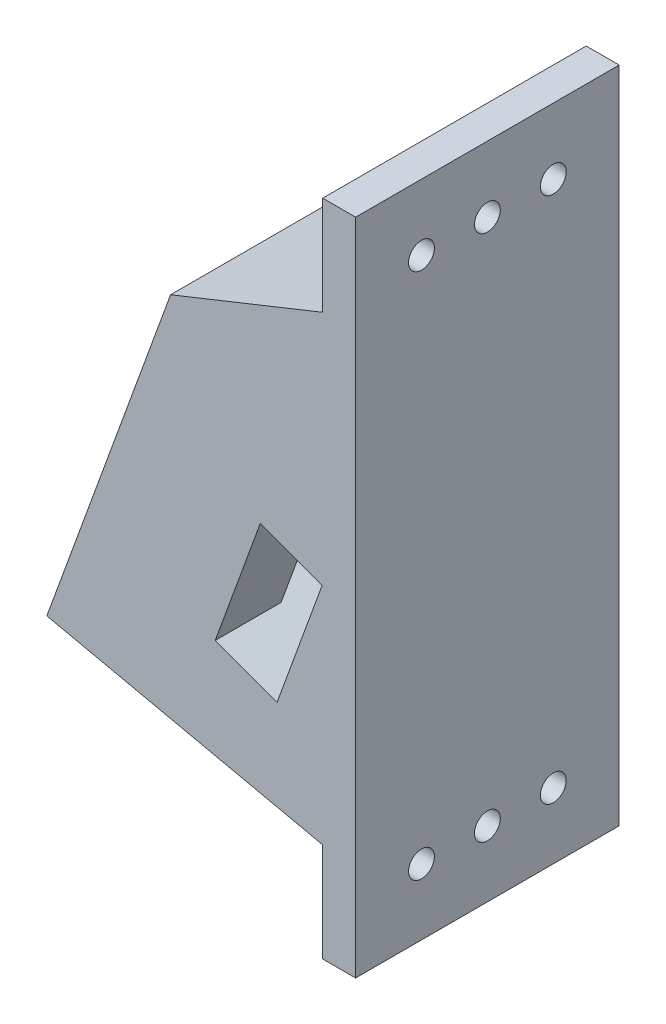
ISO-10303-21;
HEADER;
FILE_DESCRIPTION(('STEP AP214'),'2;1');
FILE_NAME('part.step','',(''),(''),'','','');
FILE_SCHEMA(('AUTOMOTIVE_DESIGN { 1 0 10303 214 1 1 1 1 }'));
ENDSEC;
DATA;
#1=APPLICATION_CONTEXT('core data for automotive mechanical design processes');
#2=APPLICATION_PROTOCOL_DEFINITION('international standard','automotive_design',2000,#1);
#3=PRODUCT_CONTEXT('',#1,'mechanical');
#4=PRODUCT('Part','Part','',(#3));
#5=PRODUCT_RELATED_PRODUCT_CATEGORY('part','',(#4));
#6=PRODUCT_DEFINITION_FORMATION('','',#4);
#7=PRODUCT_DEFINITION_CONTEXT('part definition',#1,'design');
#8=PRODUCT_DEFINITION('design','',#6,#7);
#9=PRODUCT_DEFINITION_SHAPE('','',#8);
#10=(LENGTH_UNIT() NAMED_UNIT(*) SI_UNIT(.MILLI.,.METRE.));
#11=(NAMED_UNIT(*) PLANE_ANGLE_UNIT() SI_UNIT($,.RADIAN.));
#12=(NAMED_UNIT(*) SI_UNIT($,.STERADIAN.) SOLID_ANGLE_UNIT());
#13=UNCERTAINTY_MEASURE_WITH_UNIT(LENGTH_MEASURE(1.E-05),#10,'distance_accuracy_value','');
#14=(GEOMETRIC_REPRESENTATION_CONTEXT(3) GLOBAL_UNCERTAINTY_ASSIGNED_CONTEXT((#13)) GLOBAL_UNIT_ASSIGNED_CONTEXT((#10,
#11,#12)) REPRESENTATION_CONTEXT('',''));
#15=CARTESIAN_POINT('',(0.,0.,0.));
#16=DIRECTION('',(0.,0.,1.));
#17=DIRECTION('',(1.,0.,0.));
#18=AXIS2_PLACEMENT_3D('',#15,#16,#17);
#19=CARTESIAN_POINT('',(-12.9038688104835,4.69662415389204,0.));
#20=DIRECTION('',(0.939692620785908,-0.34202014332567,0.));
#21=DIRECTION('',(0.34202014332567,0.939692620785908,0.));
#22=AXIS2_PLACEMENT_3D('',#19,#20,#21);
#23=PLANE('',#22);
#24=CARTESIAN_POINT('',(-34.6405452676712,-55.0244035862219,10.48));
#25=DIRECTION('',(0.939692620785908,-0.34202014332567,0.));
#26=DIRECTION('',(0.34202014332567,0.939692620785908,0.));
#27=AXIS2_PLACEMENT_3D('',#24,#25,#26);
#28=CIRCLE('',#27,2.54);
#29=CARTESIAN_POINT('',(-33.771814103624,-52.6375843294257,10.48));
#30=VERTEX_POINT('',#29);
#31=EDGE_CURVE('E11',#30,#30,#28,.F.);
#32=ORIENTED_EDGE('',*,*,#31,.F.);
#33=EDGE_LOOP('',(#32));
#34=FACE_BOUND('',#33,.T.);
#35=CARTESIAN_POINT('',(-34.6405452676712,-55.024403586222,40.32));
#36=DIRECTION('',(0.939692620785908,-0.34202014332567,0.));
#37=DIRECTION('',(0.34202014332567,0.939692620785908,0.));
#38=AXIS2_PLACEMENT_3D('',#35,#36,#37);
#39=CIRCLE('',#38,2.54);
#40=CARTESIAN_POINT('',(-33.771814103624,-52.6375843294258,40.32));
#41=VERTEX_POINT('',#40);
#42=EDGE_CURVE('E41',#41,#41,#39,.F.);
#43=ORIENTED_EDGE('',*,*,#42,.F.);
#44=EDGE_LOOP('',(#43));
#45=FACE_BOUND('',#44,.T.);
#46=CARTESIAN_POINT('',(-22.7245634742049,-22.2855126780409,40.32));
#47=DIRECTION('',(0.939692620785908,-0.34202014332567,0.));
#48=DIRECTION('',(0.34202014332567,0.939692620785908,0.));
#49=AXIS2_PLACEMENT_3D('',#46,#47,#48);
#50=CIRCLE('',#49,2.54);
#51=CARTESIAN_POINT('',(-21.8558323101577,-19.8986934212447,40.32));
#52=VERTEX_POINT('',#51);
#53=EDGE_CURVE('E344',#52,#52,#50,.F.);
#54=ORIENTED_EDGE('',*,*,#53,.F.);
#55=EDGE_LOOP('',(#54));
#56=FACE_BOUND('',#55,.T.);
#57=CARTESIAN_POINT('',(-22.7245634742049,-22.2855126780409,10.48));
#58=DIRECTION('',(0.939692620785908,-0.34202014332567,0.));
#59=DIRECTION('',(0.34202014332567,0.939692620785908,0.));
#60=AXIS2_PLACEMENT_3D('',#57,#58,#59);
#61=CIRCLE('',#60,2.54);
#62=CARTESIAN_POINT('',(-21.8558323101577,-19.8986934212447,10.48));
#63=VERTEX_POINT('',#62);
#64=EDGE_CURVE('E324',#63,#63,#61,.F.);
#65=ORIENTED_EDGE('',*,*,#64,.F.);
#66=EDGE_LOOP('',(#65));
#67=FACE_BOUND('',#66,.T.);
#68=DIRECTION('',(0.34202014332567,0.939692620785908,0.));
#69=VECTOR('',#68,1.);
#70=CARTESIAN_POINT('',(-36.3780075957656,-59.7980420998143,45.4));
#71=LINE('',#70,#69);
#72=CARTESIAN_POINT('',(-36.3780075957656,-59.7980420998143,45.4));
#73=VERTEX_POINT('',#72);
#74=CARTESIAN_POINT('',(-20.9871011461105,-17.5118741644485,45.4));
#75=VERTEX_POINT('',#74);
#76=EDGE_CURVE('E249',#73,#75,#71,.T.);
#77=ORIENTED_EDGE('',*,*,#76,.T.);
#78=DIRECTION('',(0.,0.,-1.));
#79=VECTOR('',#78,1.);
#80=CARTESIAN_POINT('',(-20.9871011461105,-17.5118741644485,5.40000000000001));
#81=LINE('',#80,#79);
#82=CARTESIAN_POINT('',(-20.9871011461105,-17.5118741644485,5.40000000000001));
#83=VERTEX_POINT('',#82);
#84=EDGE_CURVE('E252',#75,#83,#81,.T.);
#85=ORIENTED_EDGE('',*,*,#84,.T.);
#86=DIRECTION('',(-0.34202014332567,-0.939692620785908,0.));
#87=VECTOR('',#86,1.);
#88=CARTESIAN_POINT('',(-36.3780075957656,-59.7980420998143,5.40000000000001));
#89=LINE('',#88,#87);
#90=CARTESIAN_POINT('',(-36.3780075957656,-59.7980420998143,5.40000000000001));
#91=VERTEX_POINT('',#90);
#92=EDGE_CURVE('E256',#83,#91,#89,.T.);
#93=ORIENTED_EDGE('',*,*,#92,.T.);
#94=DIRECTION('',(0.,0.,1.));
#95=VECTOR('',#94,1.);
#96=CARTESIAN_POINT('',(-36.3780075957656,-59.7980420998143,5.40000000000001));
#97=LINE('',#96,#95);
#98=EDGE_CURVE('E259',#91,#73,#97,.T.);
#99=ORIENTED_EDGE('',*,*,#98,.T.);
#100=EDGE_LOOP('',(#77,#85,#93,#99));
#101=FACE_BOUND('',#100,.T.);
#102=DIRECTION('',(0.342020143325669,0.939692620785908,0.));
#103=VECTOR('',#102,1.);
#104=CARTESIAN_POINT('',(-33.0262101911741,-50.5890544161125,38.1));
#105=LINE('',#104,#103);
#106=CARTESIAN_POINT('',(-33.0262101911741,-50.5890544161125,38.1));
#107=VERTEX_POINT('',#106);
#108=CARTESIAN_POINT('',(-24.3388985507021,-26.7208618481504,38.1));
#109=VERTEX_POINT('',#108);
#110=EDGE_CURVE('E216',#107,#109,#105,.T.);
#111=ORIENTED_EDGE('',*,*,#110,.F.);
#112=DIRECTION('',(0.,0.,1.));
#113=VECTOR('',#112,1.);
#114=CARTESIAN_POINT('',(-33.0262101911741,-50.5890544161125,12.7));
#115=LINE('',#114,#113);
#116=CARTESIAN_POINT('',(-33.0262101911741,-50.5890544161125,12.7));
#117=VERTEX_POINT('',#116);
#118=EDGE_CURVE('E217',#117,#107,#115,.T.);
#119=ORIENTED_EDGE('',*,*,#118,.F.);
#120=DIRECTION('',(-0.342020143325669,-0.939692620785908,0.));
#121=VECTOR('',#120,1.);
#122=CARTESIAN_POINT('',(-33.0262101911741,-50.5890544161125,12.7));
#123=LINE('',#122,#121);
#124=CARTESIAN_POINT('',(-24.3388985507021,-26.7208618481504,12.7));
#125=VERTEX_POINT('',#124);
#126=EDGE_CURVE('E224',#125,#117,#123,.T.);
#127=ORIENTED_EDGE('',*,*,#126,.F.);
#128=DIRECTION('',(0.,0.,-1.));
#129=VECTOR('',#128,1.);
#130=CARTESIAN_POINT('',(-24.3388985507021,-26.7208618481504,12.7));
#131=LINE('',#130,#129);
#132=EDGE_CURVE('E221',#109,#125,#131,.T.);
#133=ORIENTED_EDGE('',*,*,#132,.F.);
#134=EDGE_LOOP('',(#111,#119,#127,#133));
#135=FACE_BOUND('',#134,.T.);
#136=ADVANCED_FACE('F33',(#34,#45,#56,#67,#101,#135),#23,.F.);
#137=CARTESIAN_POINT('',(0.,0.,50.8));
#138=DIRECTION('',(-1.,0.,0.));
#139=DIRECTION('',(0.,0.,1.));
#140=AXIS2_PLACEMENT_3D('',#137,#138,#139);
#141=PLANE('',#140);
#142=CARTESIAN_POINT('',(0.,18.7184148869281,12.7));
#143=DIRECTION('',(-1.,0.,0.));
#144=DIRECTION('',(0.,-1.,0.));
#145=AXIS2_PLACEMENT_3D('',#142,#143,#144);
#146=CIRCLE('',#145,2.4892);
#147=CARTESIAN_POINT('',(0.,16.2292148869281,12.7));
#148=VERTEX_POINT('',#147);
#149=EDGE_CURVE('E473',#148,#148,#146,.T.);
#150=ORIENTED_EDGE('',*,*,#149,.T.);
#151=EDGE_LOOP('',(#150));
#152=FACE_BOUND('',#151,.T.);
#153=CARTESIAN_POINT('',(0.,-82.8815851130719,12.7));
#154=DIRECTION('',(-1.,0.,0.));
#155=DIRECTION('',(0.,-1.,0.));
#156=AXIS2_PLACEMENT_3D('',#153,#154,#155);
#157=CIRCLE('',#156,2.48919999999999);
#158=CARTESIAN_POINT('',(0.,-85.3707851130719,12.7));
#159=VERTEX_POINT('',#158);
#160=EDGE_CURVE('E770',#159,#159,#157,.T.);
#161=ORIENTED_EDGE('',*,*,#160,.T.);
#162=EDGE_LOOP('',(#161));
#163=FACE_BOUND('',#162,.T.);
#164=CARTESIAN_POINT('',(0.,-82.8815851130719,38.1));
#165=DIRECTION('',(-1.,0.,0.));
#166=DIRECTION('',(0.,-1.,0.));
#167=AXIS2_PLACEMENT_3D('',#164,#165,#166);
#168=CIRCLE('',#167,2.48919999999999);
#169=CARTESIAN_POINT('',(0.,-85.3707851130719,38.1));
#170=VERTEX_POINT('',#169);
#171=EDGE_CURVE('E774',#170,#170,#168,.T.);
#172=ORIENTED_EDGE('',*,*,#171,.T.);
#173=EDGE_LOOP('',(#172));
#174=FACE_BOUND('',#173,.T.);
#175=CARTESIAN_POINT('',(0.,-82.8815851130719,25.4));
#176=DIRECTION('',(-1.,0.,0.));
#177=DIRECTION('',(0.,-1.,0.));
#178=AXIS2_PLACEMENT_3D('',#175,#176,#177);
#179=CIRCLE('',#178,2.4892);
#180=CARTESIAN_POINT('',(0.,-85.3707851130719,25.4));
#181=VERTEX_POINT('',#180);
#182=EDGE_CURVE('E458',#181,#181,#179,.T.);
#183=ORIENTED_EDGE('',*,*,#182,.T.);
#184=EDGE_LOOP('',(#183));
#185=FACE_BOUND('',#184,.T.);
#186=CARTESIAN_POINT('',(0.,18.7184148869281,38.1));
#187=DIRECTION('',(-1.,0.,0.));
#188=DIRECTION('',(0.,-1.,0.));
#189=AXIS2_PLACEMENT_3D('',#186,#187,#188);
#190=CIRCLE('',#189,2.4892);
#191=CARTESIAN_POINT('',(0.,16.2292148869281,38.1));
#192=VERTEX_POINT('',#191);
#193=EDGE_CURVE('E459',#192,#192,#190,.T.);
#194=ORIENTED_EDGE('',*,*,#193,.T.);
#195=EDGE_LOOP('',(#194));
#196=FACE_BOUND('',#195,.T.);
#197=CARTESIAN_POINT('',(0.,18.7184148869281,25.4));
#198=DIRECTION('',(-1.,0.,0.));
#199=DIRECTION('',(0.,-1.,0.));
#200=AXIS2_PLACEMENT_3D('',#197,#198,#199);
#201=CIRCLE('',#200,2.4892);
#202=CARTESIAN_POINT('',(0.,16.2292148869281,25.4));
#203=VERTEX_POINT('',#202);
#204=EDGE_CURVE('E468',#203,#203,#201,.T.);
#205=ORIENTED_EDGE('',*,*,#204,.T.);
#206=EDGE_LOOP('',(#205));
#207=FACE_BOUND('',#206,.T.);
#208=DIRECTION('',(0.,1.,0.));
#209=VECTOR('',#208,1.);
#210=CARTESIAN_POINT('',(0.,0.,0.));
#211=LINE('',#210,#209);
#212=CARTESIAN_POINT('',(0.,-95.5815851130719,0.));
#213=VERTEX_POINT('',#212);
#214=CARTESIAN_POINT('',(0.,31.4184148869281,0.));
#215=VERTEX_POINT('',#214);
#216=EDGE_CURVE('E285',#213,#215,#211,.T.);
#217=ORIENTED_EDGE('',*,*,#216,.T.);
#218=DIRECTION('',(0.,0.,-1.));
#219=VECTOR('',#218,1.);
#220=CARTESIAN_POINT('',(0.,31.4184148869281,50.8));
#221=LINE('',#220,#219);
#222=CARTESIAN_POINT('',(0.,31.4184148869281,50.8));
#223=VERTEX_POINT('',#222);
#224=EDGE_CURVE('E321',#223,#215,#221,.T.);
#225=ORIENTED_EDGE('',*,*,#224,.F.);
#226=DIRECTION('',(0.,-1.,0.));
#227=VECTOR('',#226,1.);
#228=CARTESIAN_POINT('',(0.,0.,50.8));
#229=LINE('',#228,#227);
#230=CARTESIAN_POINT('',(0.,-95.5815851130719,50.8));
#231=VERTEX_POINT('',#230);
#232=EDGE_CURVE('E281',#223,#231,#229,.T.);
#233=ORIENTED_EDGE('',*,*,#232,.T.);
#234=DIRECTION('',(0.,0.,-1.));
#235=VECTOR('',#234,1.);
#236=CARTESIAN_POINT('',(0.,-95.5815851130719,50.8));
#237=LINE('',#236,#235);
#238=EDGE_CURVE('E302',#231,#213,#237,.T.);
#239=ORIENTED_EDGE('',*,*,#238,.T.);
#240=EDGE_LOOP('',(#217,#225,#233,#239));
#241=FACE_BOUND('',#240,.T.);
#242=ADVANCED_FACE('F353',(#152,#163,#174,#185,#196,#207,#241),#141,.F.);
#243=CARTESIAN_POINT('',(0.,31.4184148869281,50.8));
#244=DIRECTION('',(0.,-1.,0.));
#245=DIRECTION('',(0.,0.,-1.));
#246=AXIS2_PLACEMENT_3D('',#243,#244,#245);
#247=PLANE('',#246);
#248=DIRECTION('',(-1.,0.,0.));
#249=VECTOR('',#248,1.);
#250=CARTESIAN_POINT('',(0.,31.4184148869281,0.));
#251=LINE('',#250,#249);
#252=CARTESIAN_POINT('',(-6.35,31.4184148869281,0.));
#253=VERTEX_POINT('',#252);
#254=EDGE_CURVE('E318',#215,#253,#251,.T.);
#255=ORIENTED_EDGE('',*,*,#254,.T.);
#256=DIRECTION('',(0.,0.,-1.));
#257=VECTOR('',#256,1.);
#258=CARTESIAN_POINT('',(-6.35,31.4184148869281,50.8));
#259=LINE('',#258,#257);
#260=CARTESIAN_POINT('',(-6.35,31.4184148869281,50.8));
#261=VERTEX_POINT('',#260);
#262=EDGE_CURVE('E325',#261,#253,#259,.T.);
#263=ORIENTED_EDGE('',*,*,#262,.F.);
#264=DIRECTION('',(-1.,0.,0.));
#265=VECTOR('',#264,1.);
#266=CARTESIAN_POINT('',(0.,31.4184148869281,50.8));
#267=LINE('',#266,#265);
#268=EDGE_CURVE('E300',#223,#261,#267,.T.);
#269=ORIENTED_EDGE('',*,*,#268,.F.);
#270=ORIENTED_EDGE('',*,*,#224,.T.);
#271=EDGE_LOOP('',(#255,#263,#269,#270));
#272=FACE_BOUND('',#271,.T.);
#273=ADVANCED_FACE('F392',(#272),#247,.F.);
#274=CARTESIAN_POINT('',(-6.35,31.4184148869281,50.8));
#275=DIRECTION('',(1.,0.,0.));
#276=DIRECTION('',(0.,0.,-1.));
#277=AXIS2_PLACEMENT_3D('',#274,#275,#276);
#278=PLANE('',#277);
#279=CARTESIAN_POINT('',(-6.35,18.7184148869281,12.7));
#280=DIRECTION('',(-1.,0.,0.));
#281=DIRECTION('',(0.,-1.,0.));
#282=AXIS2_PLACEMENT_3D('',#279,#280,#281);
#283=CIRCLE('',#282,2.4892);
#284=CARTESIAN_POINT('',(-6.35,16.2292148869281,12.7));
#285=VERTEX_POINT('',#284);
#286=EDGE_CURVE('E767',#285,#285,#283,.T.);
#287=ORIENTED_EDGE('',*,*,#286,.F.);
#288=EDGE_LOOP('',(#287));
#289=FACE_BOUND('',#288,.T.);
#290=CARTESIAN_POINT('',(-6.35,18.7184148869281,38.1));
#291=DIRECTION('',(-1.,0.,0.));
#292=DIRECTION('',(0.,-1.,0.));
#293=AXIS2_PLACEMENT_3D('',#290,#291,#292);
#294=CIRCLE('',#293,2.4892);
#295=CARTESIAN_POINT('',(-6.35,16.2292148869281,38.1));
#296=VERTEX_POINT('',#295);
#297=EDGE_CURVE('E464',#296,#296,#294,.T.);
#298=ORIENTED_EDGE('',*,*,#297,.F.);
#299=EDGE_LOOP('',(#298));
#300=FACE_BOUND('',#299,.T.);
#301=CARTESIAN_POINT('',(-6.35,18.7184148869281,25.4));
#302=DIRECTION('',(-1.,0.,0.));
#303=DIRECTION('',(0.,-1.,0.));
#304=AXIS2_PLACEMENT_3D('',#301,#302,#303);
#305=CIRCLE('',#304,2.4892);
#306=CARTESIAN_POINT('',(-6.35,16.2292148869281,25.4));
#307=VERTEX_POINT('',#306);
#308=EDGE_CURVE('E471',#307,#307,#305,.T.);
#309=ORIENTED_EDGE('',*,*,#308,.F.);
#310=EDGE_LOOP('',(#309));
#311=FACE_BOUND('',#310,.T.);
#312=DIRECTION('',(0.,-1.,0.));
#313=VECTOR('',#312,1.);
#314=CARTESIAN_POINT('',(-6.35,31.4184148869281,0.));
#315=LINE('',#314,#313);
#316=CARTESIAN_POINT('',(-6.35,12.3684148869281,0.));
#317=VERTEX_POINT('',#316);
#318=EDGE_CURVE('E316',#253,#317,#315,.T.);
#319=ORIENTED_EDGE('',*,*,#318,.T.);
#320=DIRECTION('',(0.,0.,-1.));
#321=VECTOR('',#320,1.);
#322=CARTESIAN_POINT('',(-6.35,12.3684148869281,50.8));
#323=LINE('',#322,#321);
#324=CARTESIAN_POINT('',(-6.35,12.3684148869281,50.8));
#325=VERTEX_POINT('',#324);
#326=EDGE_CURVE('E328',#325,#317,#323,.T.);
#327=ORIENTED_EDGE('',*,*,#326,.F.);
#328=DIRECTION('',(0.,-1.,0.));
#329=VECTOR('',#328,1.);
#330=CARTESIAN_POINT('',(-6.35,31.4184148869281,50.8));
#331=LINE('',#330,#329);
#332=EDGE_CURVE('E298',#261,#325,#331,.T.);
#333=ORIENTED_EDGE('',*,*,#332,.F.);
#334=ORIENTED_EDGE('',*,*,#262,.T.);
#335=EDGE_LOOP('',(#319,#327,#333,#334));
#336=FACE_BOUND('',#335,.T.);
#337=ADVANCED_FACE('F397',(#289,#300,#311,#336),#278,.F.);
#338=CARTESIAN_POINT('',(-6.35,12.3684148869281,50.8));
#339=DIRECTION('',(0.371416610588182,-0.928466316771474,0.));
#340=DIRECTION('',(0.928466316771474,0.371416610588182,0.));
#341=AXIS2_PLACEMENT_3D('',#338,#339,#340);
#342=PLANE('',#341);
#343=DIRECTION('',(-0.928466316771474,-0.371416610588182,0.));
#344=VECTOR('',#343,1.);
#345=CARTESIAN_POINT('',(-6.35,12.3684148869281,0.));
#346=LINE('',#345,#344);
#347=CARTESIAN_POINT('',(-35.6631056601617,0.6422228286434,0.));
#348=VERTEX_POINT('',#347);
#349=EDGE_CURVE('E314',#317,#348,#346,.T.);
#350=ORIENTED_EDGE('',*,*,#349,.T.);
#351=DIRECTION('',(0.,0.,-1.));
#352=VECTOR('',#351,1.);
#353=CARTESIAN_POINT('',(-35.6631056601617,0.6422228286434,50.8));
#354=LINE('',#353,#352);
#355=CARTESIAN_POINT('',(-35.6631056601617,0.6422228286434,50.8));
#356=VERTEX_POINT('',#355);
#357=EDGE_CURVE('E331',#356,#348,#354,.T.);
#358=ORIENTED_EDGE('',*,*,#357,.F.);
#359=DIRECTION('',(-0.928466316771474,-0.371416610588182,0.));
#360=VECTOR('',#359,1.);
#361=CARTESIAN_POINT('',(-6.35,12.3684148869281,50.8));
#362=LINE('',#361,#360);
#363=EDGE_CURVE('E296',#325,#356,#362,.T.);
#364=ORIENTED_EDGE('',*,*,#363,.F.);
#365=ORIENTED_EDGE('',*,*,#326,.T.);
#366=EDGE_LOOP('',(#350,#358,#364,#365));
#367=FACE_BOUND('',#366,.T.);
#368=ADVANCED_FACE('F404',(#367),#342,.F.);
#369=CARTESIAN_POINT('',(-35.6631056601617,0.6422228286434,50.8));
#370=DIRECTION('',(0.939692620785908,-0.34202014332567,0.));
#371=DIRECTION('',(0.34202014332567,0.939692620785908,0.));
#372=AXIS2_PLACEMENT_3D('',#369,#370,#371);
#373=PLANE('',#372);
#374=CARTESIAN_POINT('',(-37.6091256517106,-4.70442315594458,25.4));
#375=DIRECTION('',(-0.939692620785908,0.34202014332567,0.));
#376=DIRECTION('',(-0.34202014332567,-0.939692620785908,0.));
#377=AXIS2_PLACEMENT_3D('',#374,#375,#376);
#378=CIRCLE('',#377,2.4892);
#379=CARTESIAN_POINT('',(-38.4604821924769,-7.04350602760486,25.4));
#380=VERTEX_POINT('',#379);
#381=EDGE_CURVE('E241',#380,#380,#378,.T.);
#382=ORIENTED_EDGE('',*,*,#381,.F.);
#383=EDGE_LOOP('',(#382));
#384=FACE_BOUND('',#383,.T.);
#385=CARTESIAN_POINT('',(-57.3436879216018,-58.9246873752915,25.4));
#386=DIRECTION('',(-0.939692620785908,0.34202014332567,0.));
#387=DIRECTION('',(-0.34202014332567,-0.939692620785908,0.));
#388=AXIS2_PLACEMENT_3D('',#385,#386,#387);
#389=CIRCLE('',#388,2.4892);
#390=CARTESIAN_POINT('',(-58.195044462368,-61.2637702469518,25.4));
#391=VERTEX_POINT('',#390);
#392=EDGE_CURVE('E244',#391,#391,#389,.T.);
#393=ORIENTED_EDGE('',*,*,#392,.F.);
#394=EDGE_LOOP('',(#393));
#395=FACE_BOUND('',#394,.T.);
#396=DIRECTION('',(0.,0.,-1.));
#397=VECTOR('',#396,1.);
#398=CARTESIAN_POINT('',(-39.7809535618286,-10.6714712979351,5.40000000000001));
#399=LINE('',#398,#397);
#400=CARTESIAN_POINT('',(-39.7809535618286,-10.6714712979351,45.4));
#401=VERTEX_POINT('',#400);
#402=CARTESIAN_POINT('',(-39.7809535618286,-10.6714712979351,5.40000000000001));
#403=VERTEX_POINT('',#402);
#404=EDGE_CURVE('E264',#401,#403,#399,.T.);
#405=ORIENTED_EDGE('',*,*,#404,.F.);
#406=DIRECTION('',(0.34202014332567,0.939692620785908,0.));
#407=VECTOR('',#406,1.);
#408=CARTESIAN_POINT('',(-55.1718600114838,-52.957639233301,45.4));
#409=LINE('',#408,#407);
#410=CARTESIAN_POINT('',(-55.1718600114838,-52.957639233301,45.4));
#411=VERTEX_POINT('',#410);
#412=EDGE_CURVE('E240',#411,#401,#409,.T.);
#413=ORIENTED_EDGE('',*,*,#412,.F.);
#414=DIRECTION('',(0.,0.,1.));
#415=VECTOR('',#414,1.);
#416=CARTESIAN_POINT('',(-55.1718600114838,-52.957639233301,5.40000000000001));
#417=LINE('',#416,#415);
#418=CARTESIAN_POINT('',(-55.1718600114838,-52.957639233301,5.40000000000001));
#419=VERTEX_POINT('',#418);
#420=EDGE_CURVE('E253',#419,#411,#417,.T.);
#421=ORIENTED_EDGE('',*,*,#420,.F.);
#422=DIRECTION('',(-0.34202014332567,-0.939692620785908,0.));
#423=VECTOR('',#422,1.);
#424=CARTESIAN_POINT('',(-55.1718600114838,-52.957639233301,5.40000000000001));
#425=LINE('',#424,#423);
#426=EDGE_CURVE('E267',#403,#419,#425,.T.);
#427=ORIENTED_EDGE('',*,*,#426,.F.);
#428=EDGE_LOOP('',(#405,#413,#421,#427));
#429=FACE_BOUND('',#428,.T.);
#430=DIRECTION('',(-0.34202014332567,-0.939692620785908,0.));
#431=VECTOR('',#430,1.);
#432=CARTESIAN_POINT('',(-35.6631056601617,0.6422228286434,0.));
#433=LINE('',#432,#431);
#434=CARTESIAN_POINT('',(-59.5155158317198,-64.891735517282,0.));
#435=VERTEX_POINT('',#434);
#436=EDGE_CURVE('E311',#348,#435,#433,.T.);
#437=ORIENTED_EDGE('',*,*,#436,.T.);
#438=DIRECTION('',(0.,0.,-1.));
#439=VECTOR('',#438,1.);
#440=CARTESIAN_POINT('',(-59.5155158317198,-64.891735517282,50.8));
#441=LINE('',#440,#439);
#442=CARTESIAN_POINT('',(-59.5155158317198,-64.891735517282,50.8));
#443=VERTEX_POINT('',#442);
#444=EDGE_CURVE('E334',#443,#435,#441,.T.);
#445=ORIENTED_EDGE('',*,*,#444,.F.);
#446=DIRECTION('',(-0.34202014332567,-0.939692620785908,0.));
#447=VECTOR('',#446,1.);
#448=CARTESIAN_POINT('',(-35.6631056601617,0.6422228286434,50.8));
#449=LINE('',#448,#447);
#450=EDGE_CURVE('E294',#356,#443,#449,.T.);
#451=ORIENTED_EDGE('',*,*,#450,.F.);
#452=ORIENTED_EDGE('',*,*,#357,.T.);
#453=EDGE_LOOP('',(#437,#445,#451,#452));
#454=FACE_BOUND('',#453,.T.);
#455=ADVANCED_FACE('F408',(#384,#395,#429,#454),#373,.F.);
#456=CARTESIAN_POINT('',(-6.35,-76.5315851130719,50.8));
#457=DIRECTION('',(-0.213870348394887,-0.976862054784323,0.));
#458=DIRECTION('',(0.976862054784323,-0.213870348394887,0.));
#459=AXIS2_PLACEMENT_3D('',#456,#457,#458);
#460=PLANE('',#459);
#461=DIRECTION('',(-0.976862054784323,0.213870348394887,0.));
#462=VECTOR('',#461,1.);
#463=CARTESIAN_POINT('',(-6.35,-76.5315851130719,0.));
#464=LINE('',#463,#462);
#465=CARTESIAN_POINT('',(-6.35,-76.5315851130719,0.));
#466=VERTEX_POINT('',#465);
#467=EDGE_CURVE('E308',#466,#435,#464,.T.);
#468=ORIENTED_EDGE('',*,*,#467,.F.);
#469=DIRECTION('',(0.,0.,-1.));
#470=VECTOR('',#469,1.);
#471=CARTESIAN_POINT('',(-6.35,-76.5315851130719,50.8));
#472=LINE('',#471,#470);
#473=CARTESIAN_POINT('',(-6.35,-76.5315851130719,50.8));
#474=VERTEX_POINT('',#473);
#475=EDGE_CURVE('E336',#474,#466,#472,.T.);
#476=ORIENTED_EDGE('',*,*,#475,.F.);
#477=DIRECTION('',(-0.976862054784323,0.213870348394887,0.));
#478=VECTOR('',#477,1.);
#479=CARTESIAN_POINT('',(-6.35,-76.5315851130719,50.8));
#480=LINE('',#479,#478);
#481=EDGE_CURVE('E291',#474,#443,#480,.T.);
#482=ORIENTED_EDGE('',*,*,#481,.T.);
#483=ORIENTED_EDGE('',*,*,#444,.T.);
#484=EDGE_LOOP('',(#468,#476,#482,#483));
#485=FACE_BOUND('',#484,.T.);
#486=ADVANCED_FACE('F411',(#485),#460,.T.);
#487=CARTESIAN_POINT('',(-6.35,-95.5815851130719,50.8));
#488=DIRECTION('',(-1.,0.,0.));
#489=DIRECTION('',(0.,0.,1.));
#490=AXIS2_PLACEMENT_3D('',#487,#488,#489);
#491=PLANE('',#490);
#492=CARTESIAN_POINT('',(-6.34999999999999,-82.8815851130719,12.7));
#493=DIRECTION('',(-1.,0.,0.));
#494=DIRECTION('',(0.,-1.,0.));
#495=AXIS2_PLACEMENT_3D('',#492,#493,#494);
#496=CIRCLE('',#495,2.48919999999999);
#497=CARTESIAN_POINT('',(-6.34999999999999,-85.3707851130719,12.7));
#498=VERTEX_POINT('',#497);
#499=EDGE_CURVE('E449',#498,#498,#496,.T.);
#500=ORIENTED_EDGE('',*,*,#499,.F.);
#501=EDGE_LOOP('',(#500));
#502=FACE_BOUND('',#501,.T.);
#503=CARTESIAN_POINT('',(-6.34999999999999,-82.8815851130719,38.1));
#504=DIRECTION('',(-1.,0.,0.));
#505=DIRECTION('',(0.,-1.,0.));
#506=AXIS2_PLACEMENT_3D('',#503,#504,#505);
#507=CIRCLE('',#506,2.48919999999999);
#508=CARTESIAN_POINT('',(-6.34999999999999,-85.3707851130719,38.1));
#509=VERTEX_POINT('',#508);
#510=EDGE_CURVE('E453',#509,#509,#507,.T.);
#511=ORIENTED_EDGE('',*,*,#510,.F.);
#512=EDGE_LOOP('',(#511));
#513=FACE_BOUND('',#512,.T.);
#514=CARTESIAN_POINT('',(-6.34999999999999,-82.8815851130719,25.4));
#515=DIRECTION('',(-1.,0.,0.));
#516=DIRECTION('',(0.,-1.,0.));
#517=AXIS2_PLACEMENT_3D('',#514,#515,#516);
#518=CIRCLE('',#517,2.4892);
#519=CARTESIAN_POINT('',(-6.34999999999999,-85.3707851130719,25.4));
#520=VERTEX_POINT('',#519);
#521=EDGE_CURVE('E456',#520,#520,#518,.T.);
#522=ORIENTED_EDGE('',*,*,#521,.F.);
#523=EDGE_LOOP('',(#522));
#524=FACE_BOUND('',#523,.T.);
#525=DIRECTION('',(0.,1.,0.));
#526=VECTOR('',#525,1.);
#527=CARTESIAN_POINT('',(-6.35,-95.5815851130719,0.));
#528=LINE('',#527,#526);
#529=CARTESIAN_POINT('',(-6.35,-95.5815851130719,0.));
#530=VERTEX_POINT('',#529);
#531=EDGE_CURVE('E305',#530,#466,#528,.T.);
#532=ORIENTED_EDGE('',*,*,#531,.F.);
#533=DIRECTION('',(0.,0.,-1.));
#534=VECTOR('',#533,1.);
#535=CARTESIAN_POINT('',(-6.35,-95.5815851130719,50.8));
#536=LINE('',#535,#534);
#537=CARTESIAN_POINT('',(-6.35,-95.5815851130719,50.8));
#538=VERTEX_POINT('',#537);
#539=EDGE_CURVE('E338',#538,#530,#536,.T.);
#540=ORIENTED_EDGE('',*,*,#539,.F.);
#541=DIRECTION('',(0.,1.,0.));
#542=VECTOR('',#541,1.);
#543=CARTESIAN_POINT('',(-6.35,-95.5815851130719,50.8));
#544=LINE('',#543,#542);
#545=EDGE_CURVE('E288',#538,#474,#544,.T.);
#546=ORIENTED_EDGE('',*,*,#545,.T.);
#547=ORIENTED_EDGE('',*,*,#475,.T.);
#548=EDGE_LOOP('',(#532,#540,#546,#547));
#549=FACE_BOUND('',#548,.T.);
#550=ADVANCED_FACE('F414',(#502,#513,#524,#549),#491,.T.);
#551=CARTESIAN_POINT('',(0.,-95.5815851130719,50.8));
#552=DIRECTION('',(0.,-1.,0.));
#553=DIRECTION('',(0.,0.,-1.));
#554=AXIS2_PLACEMENT_3D('',#551,#552,#553);
#555=PLANE('',#554);
#556=DIRECTION('',(-1.,0.,0.));
#557=VECTOR('',#556,1.);
#558=CARTESIAN_POINT('',(0.,-95.5815851130719,0.));
#559=LINE('',#558,#557);
#560=EDGE_CURVE('E274',#213,#530,#559,.T.);
#561=ORIENTED_EDGE('',*,*,#560,.F.);
#562=ORIENTED_EDGE('',*,*,#238,.F.);
#563=DIRECTION('',(-1.,0.,0.));
#564=VECTOR('',#563,1.);
#565=CARTESIAN_POINT('',(0.,-95.5815851130719,50.8));
#566=LINE('',#565,#564);
#567=EDGE_CURVE('E284',#231,#538,#566,.T.);
#568=ORIENTED_EDGE('',*,*,#567,.T.);
#569=ORIENTED_EDGE('',*,*,#539,.T.);
#570=EDGE_LOOP('',(#561,#562,#568,#569));
#571=FACE_BOUND('',#570,.T.);
#572=ADVANCED_FACE('F35',(#571),#555,.T.);
#573=CARTESIAN_POINT('',(0.,0.,50.8));
#574=DIRECTION('',(0.,0.,-1.));
#575=DIRECTION('',(-1.,0.,0.));
#576=AXIS2_PLACEMENT_3D('',#573,#574,#575);
#577=PLANE('',#576);
#578=DIRECTION('',(0.342020143325669,0.939692620785908,0.));
#579=VECTOR('',#578,1.);
#580=CARTESIAN_POINT('',(-18.3718504087115,-28.8926897582684,50.8));
#581=LINE('',#580,#579);
#582=CARTESIAN_POINT('',(-27.0591620491835,-52.7608823262305,50.8));
#583=VERTEX_POINT('',#582);
#584=CARTESIAN_POINT('',(-18.3718504087115,-28.8926897582684,50.8));
#585=VERTEX_POINT('',#584);
#586=EDGE_CURVE('E200',#583,#585,#581,.T.);
#587=ORIENTED_EDGE('',*,*,#586,.T.);
#588=DIRECTION('',(0.939692620785908,-0.34202014332567,0.));
#589=VECTOR('',#588,1.);
#590=CARTESIAN_POINT('',(-6.43775412473051,-33.2363455785044,50.8));
#591=LINE('',#590,#589);
#592=CARTESIAN_POINT('',(-6.43775412473051,-33.2363455785044,50.8));
#593=VERTEX_POINT('',#592);
#594=EDGE_CURVE('E191',#585,#593,#591,.T.);
#595=ORIENTED_EDGE('',*,*,#594,.T.);
#596=DIRECTION('',(-0.342020143325669,-0.939692620785908,0.));
#597=VECTOR('',#596,1.);
#598=CARTESIAN_POINT('',(-6.43775412473051,-33.2363455785044,50.8));
#599=LINE('',#598,#597);
#600=CARTESIAN_POINT('',(-15.1250657652025,-57.1045381464665,50.8));
#601=VERTEX_POINT('',#600);
#602=EDGE_CURVE('E197',#593,#601,#599,.T.);
#603=ORIENTED_EDGE('',*,*,#602,.T.);
#604=DIRECTION('',(-0.939692620785908,0.34202014332567,0.));
#605=VECTOR('',#604,1.);
#606=CARTESIAN_POINT('',(-15.1250657652025,-57.1045381464665,50.8));
#607=LINE('',#606,#605);
#608=EDGE_CURVE('E175',#601,#583,#607,.T.);
#609=ORIENTED_EDGE('',*,*,#608,.T.);
#610=EDGE_LOOP('',(#587,#595,#603,#609));
#611=FACE_BOUND('',#610,.T.);
#612=ORIENTED_EDGE('',*,*,#232,.F.);
#613=ORIENTED_EDGE('',*,*,#268,.T.);
#614=ORIENTED_EDGE('',*,*,#332,.T.);
#615=ORIENTED_EDGE('',*,*,#363,.T.);
#616=ORIENTED_EDGE('',*,*,#450,.T.);
#617=ORIENTED_EDGE('',*,*,#481,.F.);
#618=ORIENTED_EDGE('',*,*,#545,.F.);
#619=ORIENTED_EDGE('',*,*,#567,.F.);
#620=EDGE_LOOP('',(#612,#613,#614,#615,#616,#617,#618,#619));
#621=FACE_BOUND('',#620,.T.);
#622=ADVANCED_FACE('F380',(#611,#621),#577,.F.);
#623=CARTESIAN_POINT('',(0.,0.,0.));
#624=DIRECTION('',(0.,0.,-1.));
#625=DIRECTION('',(-1.,0.,0.));
#626=AXIS2_PLACEMENT_3D('',#623,#624,#625);
#627=PLANE('',#626);
#628=DIRECTION('',(0.939692620785908,-0.34202014332567,0.));
#629=VECTOR('',#628,1.);
#630=CARTESIAN_POINT('',(-6.43775412473051,-33.2363455785044,0.));
#631=LINE('',#630,#629);
#632=CARTESIAN_POINT('',(-18.3718504087115,-28.8926897582684,0.));
#633=VERTEX_POINT('',#632);
#634=CARTESIAN_POINT('',(-6.43775412473051,-33.2363455785044,0.));
#635=VERTEX_POINT('',#634);
#636=EDGE_CURVE('E184',#633,#635,#631,.T.);
#637=ORIENTED_EDGE('',*,*,#636,.F.);
#638=DIRECTION('',(0.342020143325669,0.939692620785908,0.));
#639=VECTOR('',#638,1.);
#640=CARTESIAN_POINT('',(-18.3718504087115,-28.8926897582684,0.));
#641=LINE('',#640,#639);
#642=CARTESIAN_POINT('',(-27.0591620491835,-52.7608823262305,0.));
#643=VERTEX_POINT('',#642);
#644=EDGE_CURVE('E189',#643,#633,#641,.T.);
#645=ORIENTED_EDGE('',*,*,#644,.F.);
#646=DIRECTION('',(-0.939692620785908,0.34202014332567,0.));
#647=VECTOR('',#646,1.);
#648=CARTESIAN_POINT('',(-15.1250657652025,-57.1045381464665,0.));
#649=LINE('',#648,#647);
#650=CARTESIAN_POINT('',(-15.1250657652025,-57.1045381464665,0.));
#651=VERTEX_POINT('',#650);
#652=EDGE_CURVE('E172',#651,#643,#649,.T.);
#653=ORIENTED_EDGE('',*,*,#652,.F.);
#654=DIRECTION('',(-0.342020143325669,-0.939692620785908,0.));
#655=VECTOR('',#654,1.);
#656=CARTESIAN_POINT('',(-6.43775412473051,-33.2363455785044,0.));
#657=LINE('',#656,#655);
#658=EDGE_CURVE('E180',#635,#651,#657,.T.);
#659=ORIENTED_EDGE('',*,*,#658,.F.);
#660=EDGE_LOOP('',(#637,#645,#653,#659));
#661=FACE_BOUND('',#660,.T.);
#662=ORIENTED_EDGE('',*,*,#216,.F.);
#663=ORIENTED_EDGE('',*,*,#560,.T.);
#664=ORIENTED_EDGE('',*,*,#531,.T.);
#665=ORIENTED_EDGE('',*,*,#467,.T.);
#666=ORIENTED_EDGE('',*,*,#436,.F.);
#667=ORIENTED_EDGE('',*,*,#349,.F.);
#668=ORIENTED_EDGE('',*,*,#318,.F.);
#669=ORIENTED_EDGE('',*,*,#254,.F.);
#670=EDGE_LOOP('',(#662,#663,#664,#665,#666,#667,#668,#669));
#671=FACE_BOUND('',#670,.T.);
#672=ADVANCED_FACE('F186',(#661,#671),#627,.T.);
#673=CARTESIAN_POINT('',(-36.3780075957656,-59.7980420998143,45.4));
#674=DIRECTION('',(0.,0.,1.));
#675=DIRECTION('',(1.,0.,0.));
#676=AXIS2_PLACEMENT_3D('',#673,#674,#675);
#677=PLANE('',#676);
#678=ORIENTED_EDGE('',*,*,#412,.T.);
#679=DIRECTION('',(-0.939692620785908,0.34202014332567,0.));
#680=VECTOR('',#679,1.);
#681=CARTESIAN_POINT('',(-20.9871011461105,-17.5118741644485,45.4));
#682=LINE('',#681,#680);
#683=EDGE_CURVE('E262',#75,#401,#682,.T.);
#684=ORIENTED_EDGE('',*,*,#683,.F.);
#685=ORIENTED_EDGE('',*,*,#76,.F.);
#686=DIRECTION('',(-0.939692620785908,0.34202014332567,0.));
#687=VECTOR('',#686,1.);
#688=CARTESIAN_POINT('',(-36.3780075957656,-59.7980420998143,45.4));
#689=LINE('',#688,#687);
#690=EDGE_CURVE('E272',#73,#411,#689,.T.);
#691=ORIENTED_EDGE('',*,*,#690,.T.);
#692=EDGE_LOOP('',(#678,#684,#685,#691));
#693=FACE_BOUND('',#692,.T.);
#694=ADVANCED_FACE('F418',(#693),#677,.F.);
#695=CARTESIAN_POINT('',(-36.3780075957656,-59.7980420998143,5.40000000000001));
#696=DIRECTION('',(-0.34202014332567,-0.939692620785908,0.));
#697=DIRECTION('',(0.939692620785908,-0.34202014332567,0.));
#698=AXIS2_PLACEMENT_3D('',#695,#696,#697);
#699=PLANE('',#698);
#700=ORIENTED_EDGE('',*,*,#420,.T.);
#701=ORIENTED_EDGE('',*,*,#690,.F.);
#702=ORIENTED_EDGE('',*,*,#98,.F.);
#703=DIRECTION('',(-0.939692620785908,0.34202014332567,0.));
#704=VECTOR('',#703,1.);
#705=CARTESIAN_POINT('',(-36.3780075957656,-59.7980420998143,5.40000000000001));
#706=LINE('',#705,#704);
#707=EDGE_CURVE('E275',#91,#419,#706,.T.);
#708=ORIENTED_EDGE('',*,*,#707,.T.);
#709=EDGE_LOOP('',(#700,#701,#702,#708));
#710=FACE_BOUND('',#709,.T.);
#711=ADVANCED_FACE('F423',(#710),#699,.F.);
#712=CARTESIAN_POINT('',(-36.3780075957656,-59.7980420998143,5.40000000000001));
#713=DIRECTION('',(0.,0.,-1.));
#714=DIRECTION('',(-1.,0.,0.));
#715=AXIS2_PLACEMENT_3D('',#712,#713,#714);
#716=PLANE('',#715);
#717=ORIENTED_EDGE('',*,*,#426,.T.);
#718=ORIENTED_EDGE('',*,*,#707,.F.);
#719=ORIENTED_EDGE('',*,*,#92,.F.);
#720=DIRECTION('',(-0.939692620785908,0.34202014332567,0.));
#721=VECTOR('',#720,1.);
#722=CARTESIAN_POINT('',(-20.9871011461105,-17.5118741644485,5.40000000000001));
#723=LINE('',#722,#721);
#724=EDGE_CURVE('E277',#83,#403,#723,.T.);
#725=ORIENTED_EDGE('',*,*,#724,.T.);
#726=EDGE_LOOP('',(#717,#718,#719,#725));
#727=FACE_BOUND('',#726,.T.);
#728=ADVANCED_FACE('F515',(#727),#716,.F.);
#729=CARTESIAN_POINT('',(-20.9871011461105,-17.5118741644485,5.40000000000001));
#730=DIRECTION('',(0.34202014332567,0.939692620785908,0.));
#731=DIRECTION('',(-0.939692620785908,0.34202014332567,0.));
#732=AXIS2_PLACEMENT_3D('',#729,#730,#731);
#733=PLANE('',#732);
#734=ORIENTED_EDGE('',*,*,#404,.T.);
#735=ORIENTED_EDGE('',*,*,#724,.F.);
#736=ORIENTED_EDGE('',*,*,#84,.F.);
#737=ORIENTED_EDGE('',*,*,#683,.T.);
#738=EDGE_LOOP('',(#734,#735,#736,#737));
#739=FACE_BOUND('',#738,.T.);
#740=ADVANCED_FACE('F508',(#739),#733,.F.);
#741=CARTESIAN_POINT('',(-40.6359531240283,-65.0058055236219,25.4));
#742=DIRECTION('',(-0.939692620785908,0.34202014332567,0.));
#743=DIRECTION('',(-0.34202014332567,-0.939692620785908,0.));
#744=AXIS2_PLACEMENT_3D('',#741,#742,#743);
#745=CYLINDRICAL_SURFACE('',#744,2.4892);
#746=CARTESIAN_POINT('',(-40.6359531240283,-65.0058055236219,25.4));
#747=DIRECTION('',(-0.939692620785908,0.34202014332567,0.));
#748=DIRECTION('',(-0.34202014332567,-0.939692620785908,0.));
#749=AXIS2_PLACEMENT_3D('',#746,#747,#748);
#750=CIRCLE('',#749,2.4892);
#751=CARTESIAN_POINT('',(-41.4873096647946,-67.3448883952822,25.4));
#752=VERTEX_POINT('',#751);
#753=EDGE_CURVE('E231',#752,#752,#750,.T.);
#754=ORIENTED_EDGE('',*,*,#753,.F.);
#755=EDGE_LOOP('',(#754));
#756=FACE_BOUND('',#755,.T.);
#757=ORIENTED_EDGE('',*,*,#392,.T.);
#758=EDGE_LOOP('',(#757));
#759=FACE_BOUND('',#758,.T.);
#760=ADVANCED_FACE('F505',(#756,#759),#745,.F.);
#761=CARTESIAN_POINT('',(-40.6359531240283,-65.0058055236219,25.4));
#762=DIRECTION('',(-0.939692620785908,0.34202014332567,0.));
#763=DIRECTION('',(-0.34202014332567,-0.939692620785908,0.));
#764=AXIS2_PLACEMENT_3D('',#761,#762,#763);
#765=PLANE('',#764);
#766=ORIENTED_EDGE('',*,*,#753,.T.);
#767=EDGE_LOOP('',(#766));
#768=FACE_BOUND('',#767,.T.);
#769=ADVANCED_FACE('F503',(#768),#765,.T.);
#770=CARTESIAN_POINT('',(-20.9013908541372,-10.785541304275,25.4));
#771=DIRECTION('',(-0.939692620785908,0.34202014332567,0.));
#772=DIRECTION('',(-0.34202014332567,-0.939692620785908,0.));
#773=AXIS2_PLACEMENT_3D('',#770,#771,#772);
#774=CYLINDRICAL_SURFACE('',#773,2.4892);
#775=CARTESIAN_POINT('',(-20.9013908541372,-10.785541304275,25.4));
#776=DIRECTION('',(-0.939692620785908,0.34202014332567,0.));
#777=DIRECTION('',(-0.34202014332567,-0.939692620785908,0.));
#778=AXIS2_PLACEMENT_3D('',#775,#776,#777);
#779=CIRCLE('',#778,2.4892);
#780=CARTESIAN_POINT('',(-21.7527473949035,-13.1246241759353,25.4));
#781=VERTEX_POINT('',#780);
#782=EDGE_CURVE('E237',#781,#781,#779,.T.);
#783=ORIENTED_EDGE('',*,*,#782,.F.);
#784=EDGE_LOOP('',(#783));
#785=FACE_BOUND('',#784,.T.);
#786=ORIENTED_EDGE('',*,*,#381,.T.);
#787=EDGE_LOOP('',(#786));
#788=FACE_BOUND('',#787,.T.);
#789=ADVANCED_FACE('F499',(#785,#788),#774,.F.);
#790=CARTESIAN_POINT('',(-20.9013908541372,-10.785541304275,25.4));
#791=DIRECTION('',(-0.939692620785908,0.34202014332567,0.));
#792=DIRECTION('',(-0.34202014332567,-0.939692620785908,0.));
#793=AXIS2_PLACEMENT_3D('',#790,#791,#792);
#794=PLANE('',#793);
#795=ORIENTED_EDGE('',*,*,#782,.T.);
#796=EDGE_LOOP('',(#795));
#797=FACE_BOUND('',#796,.T.);
#798=ADVANCED_FACE('F496',(#797),#794,.T.);
#799=CARTESIAN_POINT('',(-15.1250657652025,-57.1045381464665,38.1));
#800=DIRECTION('',(0.,0.,1.));
#801=DIRECTION('',(1.,0.,0.));
#802=AXIS2_PLACEMENT_3D('',#799,#800,#801);
#803=PLANE('',#802);
#804=DIRECTION('',(-0.939692620785908,0.342020143325669,0.));
#805=VECTOR('',#804,1.);
#806=CARTESIAN_POINT('',(-6.43775412473051,-33.2363455785044,38.1));
#807=LINE('',#806,#805);
#808=CARTESIAN_POINT('',(-18.3718504087115,-28.8926897582684,38.1));
#809=VERTEX_POINT('',#808);
#810=EDGE_CURVE('E177',#809,#109,#807,.T.);
#811=ORIENTED_EDGE('',*,*,#810,.F.);
#812=DIRECTION('',(-0.342020143325669,-0.939692620785908,0.));
#813=VECTOR('',#812,1.);
#814=CARTESIAN_POINT('',(-27.0591620491836,-52.7608823262305,38.1));
#815=LINE('',#814,#813);
#816=CARTESIAN_POINT('',(-27.0591620491835,-52.7608823262305,38.1));
#817=VERTEX_POINT('',#816);
#818=EDGE_CURVE('E213',#809,#817,#815,.T.);
#819=ORIENTED_EDGE('',*,*,#818,.T.);
#820=DIRECTION('',(-0.939692620785908,0.342020143325669,0.));
#821=VECTOR('',#820,1.);
#822=CARTESIAN_POINT('',(-15.1250657652025,-57.1045381464665,38.1));
#823=LINE('',#822,#821);
#824=EDGE_CURVE('E229',#817,#107,#823,.T.);
#825=ORIENTED_EDGE('',*,*,#824,.T.);
#826=ORIENTED_EDGE('',*,*,#110,.T.);
#827=EDGE_LOOP('',(#811,#819,#825,#826));
#828=FACE_BOUND('',#827,.T.);
#829=ADVANCED_FACE('F368',(#828),#803,.F.);
#830=CARTESIAN_POINT('',(-15.1250657652025,-57.1045381464665,12.7));
#831=DIRECTION('',(-0.342020143325669,-0.939692620785908,0.));
#832=DIRECTION('',(0.939692620785908,-0.342020143325669,0.));
#833=AXIS2_PLACEMENT_3D('',#830,#831,#832);
#834=PLANE('',#833);
#835=ORIENTED_EDGE('',*,*,#824,.F.);
#836=DIRECTION('',(0.,0.,-1.));
#837=VECTOR('',#836,1.);
#838=CARTESIAN_POINT('',(-27.0591620491835,-52.7608823262305,50.8));
#839=LINE('',#838,#837);
#840=EDGE_CURVE('E209',#583,#817,#839,.T.);
#841=ORIENTED_EDGE('',*,*,#840,.F.);
#842=ORIENTED_EDGE('',*,*,#608,.F.);
#843=DIRECTION('',(0.,0.,1.));
#844=VECTOR('',#843,1.);
#845=CARTESIAN_POINT('',(-15.1250657652025,-57.1045381464665,12.7));
#846=LINE('',#845,#844);
#847=EDGE_CURVE('E48',#651,#601,#846,.T.);
#848=ORIENTED_EDGE('',*,*,#847,.F.);
#849=ORIENTED_EDGE('',*,*,#652,.T.);
#850=CARTESIAN_POINT('',(-27.0591620491835,-52.7608823262305,12.7));
#851=VERTEX_POINT('',#850);
#852=EDGE_CURVE('E203',#851,#643,#839,.T.);
#853=ORIENTED_EDGE('',*,*,#852,.F.);
#854=DIRECTION('',(-0.939692620785908,0.342020143325669,0.));
#855=VECTOR('',#854,1.);
#856=CARTESIAN_POINT('',(-15.1250657652025,-57.1045381464665,12.7));
#857=LINE('',#856,#855);
#858=EDGE_CURVE('E232',#851,#117,#857,.T.);
#859=ORIENTED_EDGE('',*,*,#858,.T.);
#860=ORIENTED_EDGE('',*,*,#118,.T.);
#861=EDGE_LOOP('',(#835,#841,#842,#848,#849,#853,#859,#860));
#862=FACE_BOUND('',#861,.T.);
#863=ADVANCED_FACE('F169',(#862),#834,.F.);
#864=CARTESIAN_POINT('',(-15.1250657652025,-57.1045381464665,12.7));
#865=DIRECTION('',(0.,0.,-1.));
#866=DIRECTION('',(-1.,0.,0.));
#867=AXIS2_PLACEMENT_3D('',#864,#865,#866);
#868=PLANE('',#867);
#869=ORIENTED_EDGE('',*,*,#858,.F.);
#870=DIRECTION('',(0.342020143325669,0.939692620785908,0.));
#871=VECTOR('',#870,1.);
#872=CARTESIAN_POINT('',(-27.0591620491836,-52.7608823262305,12.7));
#873=LINE('',#872,#871);
#874=CARTESIAN_POINT('',(-18.3718504087115,-28.8926897582684,12.7));
#875=VERTEX_POINT('',#874);
#876=EDGE_CURVE('E207',#851,#875,#873,.T.);
#877=ORIENTED_EDGE('',*,*,#876,.T.);
#878=DIRECTION('',(-0.939692620785908,0.342020143325669,0.));
#879=VECTOR('',#878,1.);
#880=CARTESIAN_POINT('',(-6.43775412473051,-33.2363455785044,12.7));
#881=LINE('',#880,#879);
#882=EDGE_CURVE('E234',#875,#125,#881,.T.);
#883=ORIENTED_EDGE('',*,*,#882,.T.);
#884=ORIENTED_EDGE('',*,*,#126,.T.);
#885=EDGE_LOOP('',(#869,#877,#883,#884));
#886=FACE_BOUND('',#885,.T.);
#887=ADVANCED_FACE('F371',(#886),#868,.F.);
#888=CARTESIAN_POINT('',(-6.43775412473051,-33.2363455785044,12.7));
#889=DIRECTION('',(0.342020143325669,0.939692620785908,0.));
#890=DIRECTION('',(-0.939692620785908,0.342020143325669,0.));
#891=AXIS2_PLACEMENT_3D('',#888,#889,#890);
#892=PLANE('',#891);
#893=ORIENTED_EDGE('',*,*,#882,.F.);
#894=DIRECTION('',(0.,0.,-1.));
#895=VECTOR('',#894,1.);
#896=CARTESIAN_POINT('',(-18.3718504087115,-28.8926897582684,50.8));
#897=LINE('',#896,#895);
#898=EDGE_CURVE('E208',#875,#633,#897,.T.);
#899=ORIENTED_EDGE('',*,*,#898,.T.);
#900=ORIENTED_EDGE('',*,*,#636,.T.);
#901=DIRECTION('',(0.,0.,-1.));
#902=VECTOR('',#901,1.);
#903=CARTESIAN_POINT('',(-6.43775412473051,-33.2363455785044,12.7));
#904=LINE('',#903,#902);
#905=EDGE_CURVE('E53',#593,#635,#904,.T.);
#906=ORIENTED_EDGE('',*,*,#905,.F.);
#907=ORIENTED_EDGE('',*,*,#594,.F.);
#908=EDGE_CURVE('E204',#585,#809,#897,.T.);
#909=ORIENTED_EDGE('',*,*,#908,.T.);
#910=ORIENTED_EDGE('',*,*,#810,.T.);
#911=ORIENTED_EDGE('',*,*,#132,.T.);
#912=EDGE_LOOP('',(#893,#899,#900,#906,#907,#909,#910,#911));
#913=FACE_BOUND('',#912,.T.);
#914=ADVANCED_FACE('F374',(#913),#892,.F.);
#915=CARTESIAN_POINT('',(4.99727561548803,-1.81885957646196,0.));
#916=DIRECTION('',(0.939692620785908,-0.34202014332567,0.));
#917=DIRECTION('',(0.34202014332567,0.939692620785908,0.));
#918=AXIS2_PLACEMENT_3D('',#915,#916,#917);
#919=PLANE('',#918);
#920=ORIENTED_EDGE('',*,*,#847,.T.);
#921=ORIENTED_EDGE('',*,*,#602,.F.);
#922=ORIENTED_EDGE('',*,*,#905,.T.);
#923=ORIENTED_EDGE('',*,*,#658,.T.);
#924=EDGE_LOOP('',(#920,#921,#922,#923));
#925=FACE_BOUND('',#924,.T.);
#926=ADVANCED_FACE('F181',(#925),#919,.F.);
#927=CARTESIAN_POINT('',(-18.3718504087115,-28.8926897582684,50.8));
#928=DIRECTION('',(-0.939692620785908,0.342020143325669,0.));
#929=DIRECTION('',(-0.342020143325669,-0.939692620785908,0.));
#930=AXIS2_PLACEMENT_3D('',#927,#928,#929);
#931=PLANE('',#930);
#932=ORIENTED_EDGE('',*,*,#852,.T.);
#933=ORIENTED_EDGE('',*,*,#644,.T.);
#934=ORIENTED_EDGE('',*,*,#898,.F.);
#935=ORIENTED_EDGE('',*,*,#876,.F.);
#936=EDGE_LOOP('',(#932,#933,#934,#935));
#937=FACE_BOUND('',#936,.T.);
#938=ADVANCED_FACE('F475',(#937),#931,.F.);
#939=ORIENTED_EDGE('',*,*,#908,.F.);
#940=ORIENTED_EDGE('',*,*,#586,.F.);
#941=ORIENTED_EDGE('',*,*,#840,.T.);
#942=ORIENTED_EDGE('',*,*,#818,.F.);
#943=EDGE_LOOP('',(#939,#940,#941,#942));
#944=FACE_BOUND('',#943,.T.);
#945=ADVANCED_FACE('F378',(#944),#931,.F.);
#946=CARTESIAN_POINT('',(0.,-82.8815851130719,25.4));
#947=DIRECTION('',(-1.,0.,0.));
#948=DIRECTION('',(0.,-1.,0.));
#949=AXIS2_PLACEMENT_3D('',#946,#947,#948);
#950=CYLINDRICAL_SURFACE('',#949,2.4892);
#951=ORIENTED_EDGE('',*,*,#182,.F.);
#952=EDGE_LOOP('',(#951));
#953=FACE_BOUND('',#952,.T.);
#954=ORIENTED_EDGE('',*,*,#521,.T.);
#955=EDGE_LOOP('',(#954));
#956=FACE_BOUND('',#955,.T.);
#957=ADVANCED_FACE('F482',(#953,#956),#950,.F.);
#958=CARTESIAN_POINT('',(0.,-82.8815851130719,38.1));
#959=DIRECTION('',(-1.,0.,0.));
#960=DIRECTION('',(0.,-1.,0.));
#961=AXIS2_PLACEMENT_3D('',#958,#959,#960);
#962=CYLINDRICAL_SURFACE('',#961,2.48919999999999);
#963=ORIENTED_EDGE('',*,*,#171,.F.);
#964=EDGE_LOOP('',(#963));
#965=FACE_BOUND('',#964,.T.);
#966=ORIENTED_EDGE('',*,*,#510,.T.);
#967=EDGE_LOOP('',(#966));
#968=FACE_BOUND('',#967,.T.);
#969=ADVANCED_FACE('F613',(#965,#968),#962,.F.);
#970=CARTESIAN_POINT('',(0.,-82.8815851130719,12.7));
#971=DIRECTION('',(-1.,0.,0.));
#972=DIRECTION('',(0.,-1.,0.));
#973=AXIS2_PLACEMENT_3D('',#970,#971,#972);
#974=CYLINDRICAL_SURFACE('',#973,2.48919999999999);
#975=ORIENTED_EDGE('',*,*,#160,.F.);
#976=EDGE_LOOP('',(#975));
#977=FACE_BOUND('',#976,.T.);
#978=ORIENTED_EDGE('',*,*,#499,.T.);
#979=EDGE_LOOP('',(#978));
#980=FACE_BOUND('',#979,.T.);
#981=ADVANCED_FACE('F622',(#977,#980),#974,.F.);
#982=CARTESIAN_POINT('',(0.,18.7184148869281,25.4));
#983=DIRECTION('',(-1.,0.,0.));
#984=DIRECTION('',(0.,-1.,0.));
#985=AXIS2_PLACEMENT_3D('',#982,#983,#984);
#986=CYLINDRICAL_SURFACE('',#985,2.4892);
#987=ORIENTED_EDGE('',*,*,#204,.F.);
#988=EDGE_LOOP('',(#987));
#989=FACE_BOUND('',#988,.T.);
#990=ORIENTED_EDGE('',*,*,#308,.T.);
#991=EDGE_LOOP('',(#990));
#992=FACE_BOUND('',#991,.T.);
#993=ADVANCED_FACE('F485',(#989,#992),#986,.F.);
#994=CARTESIAN_POINT('',(0.,18.7184148869281,38.1));
#995=DIRECTION('',(-1.,0.,0.));
#996=DIRECTION('',(0.,-1.,0.));
#997=AXIS2_PLACEMENT_3D('',#994,#995,#996);
#998=CYLINDRICAL_SURFACE('',#997,2.4892);
#999=ORIENTED_EDGE('',*,*,#193,.F.);
#1000=EDGE_LOOP('',(#999));
#1001=FACE_BOUND('',#1000,.T.);
#1002=ORIENTED_EDGE('',*,*,#297,.T.);
#1003=EDGE_LOOP('',(#1002));
#1004=FACE_BOUND('',#1003,.T.);
#1005=ADVANCED_FACE('F641',(#1001,#1004),#998,.F.);
#1006=CARTESIAN_POINT('',(0.,18.7184148869281,12.7));
#1007=DIRECTION('',(-1.,0.,0.));
#1008=DIRECTION('',(0.,-1.,0.));
#1009=AXIS2_PLACEMENT_3D('',#1006,#1007,#1008);
#1010=CYLINDRICAL_SURFACE('',#1009,2.4892);
#1011=ORIENTED_EDGE('',*,*,#149,.F.);
#1012=EDGE_LOOP('',(#1011));
#1013=FACE_BOUND('',#1012,.T.);
#1014=ORIENTED_EDGE('',*,*,#286,.T.);
#1015=EDGE_LOOP('',(#1014));
#1016=FACE_BOUND('',#1015,.T.);
#1017=ADVANCED_FACE('F650',(#1013,#1016),#1010,.F.);
#1018=CARTESIAN_POINT('',(-27.4982019877973,-20.5480503499465,10.48));
#1019=DIRECTION('',(0.939692620785908,-0.34202014332567,0.));
#1020=DIRECTION('',(0.34202014332567,0.939692620785908,0.));
#1021=AXIS2_PLACEMENT_3D('',#1018,#1019,#1020);
#1022=CYLINDRICAL_SURFACE('',#1021,2.54);
#1023=CARTESIAN_POINT('',(-27.4982019877973,-20.5480503499465,10.48));
#1024=DIRECTION('',(-0.939692620785908,0.34202014332567,0.));
#1025=DIRECTION('',(-0.34202014332567,-0.939692620785908,0.));
#1026=AXIS2_PLACEMENT_3D('',#1023,#1024,#1025);
#1027=CIRCLE('',#1026,2.54);
#1028=CARTESIAN_POINT('',(-28.3669331518445,-22.9348696067427,10.48));
#1029=VERTEX_POINT('',#1028);
#1030=EDGE_CURVE('E760',#1029,#1029,#1027,.T.);
#1031=ORIENTED_EDGE('',*,*,#1030,.F.);
#1032=EDGE_LOOP('',(#1031));
#1033=FACE_BOUND('',#1032,.T.);
#1034=ORIENTED_EDGE('',*,*,#64,.T.);
#1035=EDGE_LOOP('',(#1034));
#1036=FACE_BOUND('',#1035,.T.);
#1037=ADVANCED_FACE('F660',(#1033,#1036),#1022,.T.);
#1038=CARTESIAN_POINT('',(-27.4982019877973,-20.5480503499465,10.48));
#1039=DIRECTION('',(-0.939692620785908,0.34202014332567,0.));
#1040=DIRECTION('',(-0.34202014332567,-0.939692620785908,0.));
#1041=AXIS2_PLACEMENT_3D('',#1038,#1039,#1040);
#1042=PLANE('',#1041);
#1043=ORIENTED_EDGE('',*,*,#1030,.T.);
#1044=EDGE_LOOP('',(#1043));
#1045=FACE_BOUND('',#1044,.T.);
#1046=ADVANCED_FACE('F676',(#1045),#1042,.T.);
#1047=CARTESIAN_POINT('',(-27.4982019877973,-20.5480503499465,40.32));
#1048=DIRECTION('',(0.939692620785908,-0.34202014332567,0.));
#1049=DIRECTION('',(0.34202014332567,0.939692620785908,0.));
#1050=AXIS2_PLACEMENT_3D('',#1047,#1048,#1049);
#1051=CYLINDRICAL_SURFACE('',#1050,2.54);
#1052=CARTESIAN_POINT('',(-27.4982019877973,-20.5480503499465,40.32));
#1053=DIRECTION('',(-0.939692620785908,0.34202014332567,0.));
#1054=DIRECTION('',(0.34202014332567,0.939692620785908,0.));
#1055=AXIS2_PLACEMENT_3D('',#1052,#1053,#1054);
#1056=CIRCLE('',#1055,2.54);
#1057=CARTESIAN_POINT('',(-26.6294708237501,-18.1612310931503,40.32));
#1058=VERTEX_POINT('',#1057);
#1059=EDGE_CURVE('E755',#1058,#1058,#1056,.T.);
#1060=ORIENTED_EDGE('',*,*,#1059,.F.);
#1061=EDGE_LOOP('',(#1060));
#1062=FACE_BOUND('',#1061,.T.);
#1063=ORIENTED_EDGE('',*,*,#53,.T.);
#1064=EDGE_LOOP('',(#1063));
#1065=FACE_BOUND('',#1064,.T.);
#1066=ADVANCED_FACE('F686',(#1062,#1065),#1051,.T.);
#1067=CARTESIAN_POINT('',(-27.4982019877973,-20.5480503499465,40.32));
#1068=DIRECTION('',(0.939692620785908,-0.34202014332567,0.));
#1069=DIRECTION('',(0.34202014332567,0.939692620785908,0.));
#1070=AXIS2_PLACEMENT_3D('',#1067,#1068,#1069);
#1071=PLANE('',#1070);
#1072=ORIENTED_EDGE('',*,*,#1059,.T.);
#1073=EDGE_LOOP('',(#1072));
#1074=FACE_BOUND('',#1073,.T.);
#1075=ADVANCED_FACE('F696',(#1074),#1071,.F.);
#1076=CARTESIAN_POINT('',(-39.4141837812637,-53.2869412581275,40.32));
#1077=DIRECTION('',(0.939692620785908,-0.34202014332567,0.));
#1078=DIRECTION('',(0.34202014332567,0.939692620785908,0.));
#1079=AXIS2_PLACEMENT_3D('',#1076,#1077,#1078);
#1080=CYLINDRICAL_SURFACE('',#1079,2.54);
#1081=CARTESIAN_POINT('',(-39.4141837812637,-53.2869412581275,40.32));
#1082=DIRECTION('',(-0.939692620785908,0.34202014332567,0.));
#1083=DIRECTION('',(-0.34202014332567,-0.939692620785908,0.));
#1084=AXIS2_PLACEMENT_3D('',#1081,#1082,#1083);
#1085=CIRCLE('',#1084,2.54);
#1086=CARTESIAN_POINT('',(-40.2829149453108,-55.6737605149237,40.32));
#1087=VERTEX_POINT('',#1086);
#1088=EDGE_CURVE('E752',#1087,#1087,#1085,.T.);
#1089=ORIENTED_EDGE('',*,*,#1088,.F.);
#1090=EDGE_LOOP('',(#1089));
#1091=FACE_BOUND('',#1090,.T.);
#1092=ORIENTED_EDGE('',*,*,#42,.T.);
#1093=EDGE_LOOP('',(#1092));
#1094=FACE_BOUND('',#1093,.T.);
#1095=ADVANCED_FACE('F349',(#1091,#1094),#1080,.T.);
#1096=CARTESIAN_POINT('',(-39.4141837812637,-53.2869412581275,40.32));
#1097=DIRECTION('',(-0.939692620785908,0.34202014332567,0.));
#1098=DIRECTION('',(-0.34202014332567,-0.939692620785908,0.));
#1099=AXIS2_PLACEMENT_3D('',#1096,#1097,#1098);
#1100=PLANE('',#1099);
#1101=ORIENTED_EDGE('',*,*,#1088,.T.);
#1102=EDGE_LOOP('',(#1101));
#1103=FACE_BOUND('',#1102,.T.);
#1104=ADVANCED_FACE('F715',(#1103),#1100,.T.);
#1105=CARTESIAN_POINT('',(-39.4141837812637,-53.2869412581275,10.48));
#1106=DIRECTION('',(0.939692620785908,-0.34202014332567,0.));
#1107=DIRECTION('',(0.34202014332567,0.939692620785908,0.));
#1108=AXIS2_PLACEMENT_3D('',#1105,#1106,#1107);
#1109=CYLINDRICAL_SURFACE('',#1108,2.54);
#1110=CARTESIAN_POINT('',(-39.4141837812637,-53.2869412581275,10.48));
#1111=DIRECTION('',(-0.939692620785908,0.34202014332567,0.));
#1112=DIRECTION('',(0.34202014332567,0.939692620785908,0.));
#1113=AXIS2_PLACEMENT_3D('',#1110,#1111,#1112);
#1114=CIRCLE('',#1113,2.54);
#1115=CARTESIAN_POINT('',(-38.5454526172165,-50.9001220013313,10.48));
#1116=VERTEX_POINT('',#1115);
#1117=EDGE_CURVE('E751',#1116,#1116,#1114,.T.);
#1118=ORIENTED_EDGE('',*,*,#1117,.F.);
#1119=EDGE_LOOP('',(#1118));
#1120=FACE_BOUND('',#1119,.T.);
#1121=ORIENTED_EDGE('',*,*,#31,.T.);
#1122=EDGE_LOOP('',(#1121));
#1123=FACE_BOUND('',#1122,.T.);
#1124=ADVANCED_FACE('F725',(#1120,#1123),#1109,.T.);
#1125=CARTESIAN_POINT('',(-39.4141837812637,-53.2869412581275,10.48));
#1126=DIRECTION('',(0.939692620785908,-0.34202014332567,0.));
#1127=DIRECTION('',(0.34202014332567,0.939692620785908,0.));
#1128=AXIS2_PLACEMENT_3D('',#1125,#1126,#1127);
#1129=PLANE('',#1128);
#1130=ORIENTED_EDGE('',*,*,#1117,.T.);
#1131=EDGE_LOOP('',(#1130));
#1132=FACE_BOUND('',#1131,.T.);
#1133=ADVANCED_FACE('F735',(#1132),#1129,.F.);
#1134=CLOSED_SHELL('',(#136,#242,#273,#337,#368,#455,#486,#550,#572,#622,#672,#694,#711,#728,
#740,#760,#769,#789,#798,#829,#863,#887,#914,#926,#938,#945,#957,#969,#981,#993,#1005,#1017,
#1037,#1046,#1066,#1075,#1095,#1104,#1124,#1133));
#1135=MANIFOLD_SOLID_BREP('B2',#1134);
#1136=ADVANCED_BREP_SHAPE_REPRESENTATION('',(#18,#1135),#14);
#1137=SHAPE_DEFINITION_REPRESENTATION(#9,#1136);
ENDSEC;
END-ISO-10303-21;
